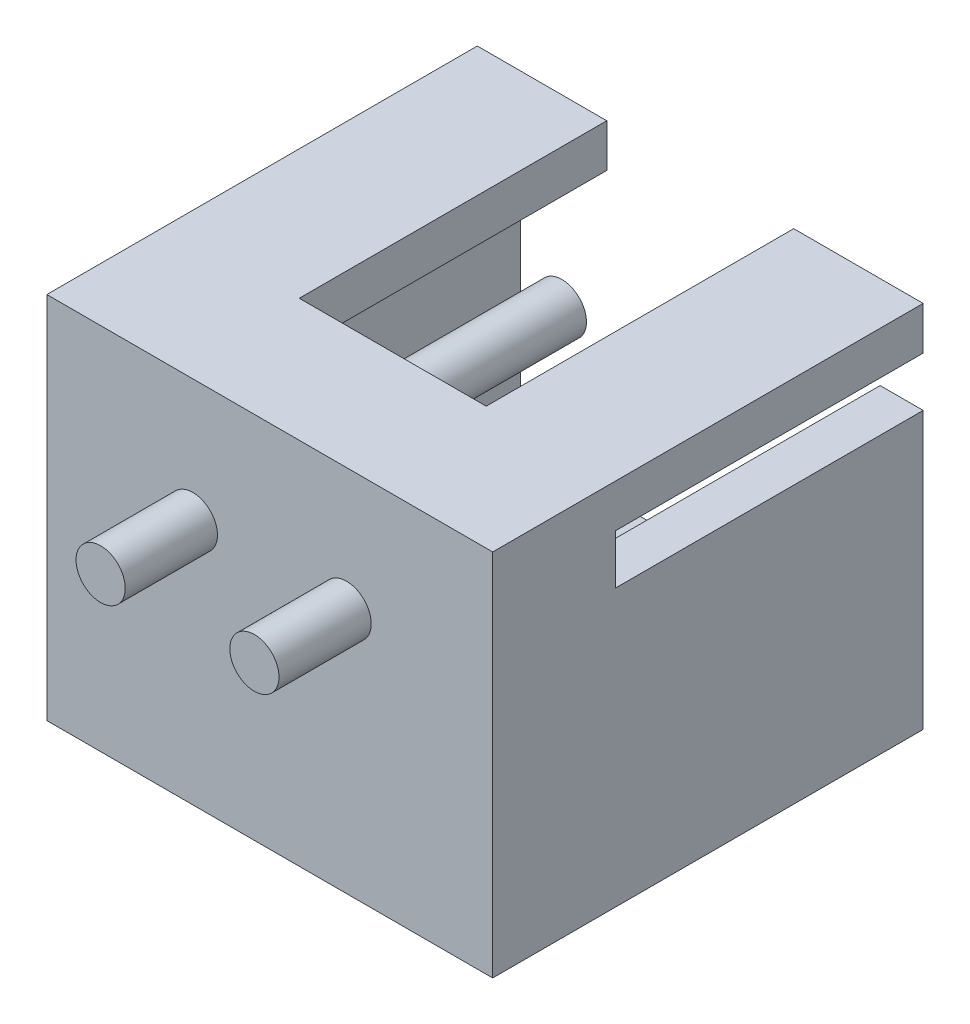
ISO-10303-21;
HEADER;
FILE_DESCRIPTION(('STEP AP214'),'2;1');
FILE_NAME('part.step','',(''),(''),'','','');
FILE_SCHEMA(('AUTOMOTIVE_DESIGN { 1 0 10303 214 1 1 1 1 }'));
ENDSEC;
DATA;
#1=APPLICATION_CONTEXT('core data for automotive mechanical design processes');
#2=APPLICATION_PROTOCOL_DEFINITION('international standard','automotive_design',2000,#1);
#3=PRODUCT_CONTEXT('',#1,'mechanical');
#4=PRODUCT('Part','Part','',(#3));
#5=PRODUCT_RELATED_PRODUCT_CATEGORY('part','',(#4));
#6=PRODUCT_DEFINITION_FORMATION('','',#4);
#7=PRODUCT_DEFINITION_CONTEXT('part definition',#1,'design');
#8=PRODUCT_DEFINITION('design','',#6,#7);
#9=PRODUCT_DEFINITION_SHAPE('','',#8);
#10=(LENGTH_UNIT() NAMED_UNIT(*) SI_UNIT(.MILLI.,.METRE.));
#11=(NAMED_UNIT(*) PLANE_ANGLE_UNIT() SI_UNIT($,.RADIAN.));
#12=(NAMED_UNIT(*) SI_UNIT($,.STERADIAN.) SOLID_ANGLE_UNIT());
#13=UNCERTAINTY_MEASURE_WITH_UNIT(LENGTH_MEASURE(1.E-05),#10,'distance_accuracy_value','');
#14=(GEOMETRIC_REPRESENTATION_CONTEXT(3) GLOBAL_UNCERTAINTY_ASSIGNED_CONTEXT((#13)) GLOBAL_UNIT_ASSIGNED_CONTEXT((#10,
#11,#12)) REPRESENTATION_CONTEXT('',''));
#15=CARTESIAN_POINT('',(0.,0.,0.));
#16=DIRECTION('',(0.,0.,1.));
#17=DIRECTION('',(1.,0.,0.));
#18=AXIS2_PLACEMENT_3D('',#15,#16,#17);
#19=CARTESIAN_POINT('',(0.,6.,0.));
#20=DIRECTION('',(0.,0.,-1.));
#21=DIRECTION('',(-1.,0.,0.));
#22=AXIS2_PLACEMENT_3D('',#19,#20,#21);
#23=PLANE('',#22);
#24=DIRECTION('',(0.,1.,0.));
#25=VECTOR('',#24,1.);
#26=CARTESIAN_POINT('',(2.10510504665402,6.,0.));
#27=LINE('',#26,#25);
#28=CARTESIAN_POINT('',(2.10510504665401,5.3,0.));
#29=VERTEX_POINT('',#28);
#30=CARTESIAN_POINT('',(2.10510504665402,6.,0.));
#31=VERTEX_POINT('',#30);
#32=EDGE_CURVE('E156',#29,#31,#27,.T.);
#33=ORIENTED_EDGE('',*,*,#32,.F.);
#34=DIRECTION('',(-1.,0.,0.));
#35=VECTOR('',#34,1.);
#36=CARTESIAN_POINT('',(0.7,5.3,0.));
#37=LINE('',#36,#35);
#38=CARTESIAN_POINT('',(0.,5.3,0.));
#39=VERTEX_POINT('',#38);
#40=EDGE_CURVE('E218',#29,#39,#37,.T.);
#41=ORIENTED_EDGE('',*,*,#40,.T.);
#42=DIRECTION('',(0.,-1.,0.));
#43=VECTOR('',#42,1.);
#44=CARTESIAN_POINT('',(0.,0.,0.));
#45=LINE('',#44,#43);
#46=CARTESIAN_POINT('',(0.,6.,0.));
#47=VERTEX_POINT('',#46);
#48=EDGE_CURVE('E246',#47,#39,#45,.T.);
#49=ORIENTED_EDGE('',*,*,#48,.F.);
#50=DIRECTION('',(-1.,0.,0.));
#51=VECTOR('',#50,1.);
#52=CARTESIAN_POINT('',(0.,6.,0.));
#53=LINE('',#52,#51);
#54=EDGE_CURVE('E173',#31,#47,#53,.T.);
#55=ORIENTED_EDGE('',*,*,#54,.F.);
#56=EDGE_LOOP('',(#33,#41,#49,#55));
#57=FACE_BOUND('',#56,.T.);
#58=ADVANCED_FACE('F35',(#57),#23,.T.);
#59=CARTESIAN_POINT('',(0.7,5.3,5.));
#60=DIRECTION('',(0.,-1.,0.));
#61=DIRECTION('',(0.,0.,-1.));
#62=AXIS2_PLACEMENT_3D('',#59,#60,#61);
#63=PLANE('',#62);
#64=DIRECTION('',(0.,0.,-1.));
#65=VECTOR('',#64,1.);
#66=CARTESIAN_POINT('',(2.10510504665401,5.3,8.1193465143883));
#67=LINE('',#66,#65);
#68=CARTESIAN_POINT('',(2.10510504665401,5.3,5.));
#69=VERTEX_POINT('',#68);
#70=EDGE_CURVE('E287',#69,#29,#67,.T.);
#71=ORIENTED_EDGE('',*,*,#70,.F.);
#72=DIRECTION('',(-1.,0.,0.));
#73=VECTOR('',#72,1.);
#74=CARTESIAN_POINT('',(0.7,5.3,5.));
#75=LINE('',#74,#73);
#76=CARTESIAN_POINT('',(0.,5.3,5.));
#77=VERTEX_POINT('',#76);
#78=EDGE_CURVE('E225',#69,#77,#75,.T.);
#79=ORIENTED_EDGE('',*,*,#78,.T.);
#80=DIRECTION('',(0.,0.,-1.));
#81=VECTOR('',#80,1.);
#82=CARTESIAN_POINT('',(0.,5.3,8.1193465143883));
#83=LINE('',#82,#81);
#84=EDGE_CURVE('E296',#77,#39,#83,.T.);
#85=ORIENTED_EDGE('',*,*,#84,.T.);
#86=ORIENTED_EDGE('',*,*,#40,.F.);
#87=EDGE_LOOP('',(#71,#79,#85,#86));
#88=FACE_BOUND('',#87,.T.);
#89=ADVANCED_FACE('F321',(#88),#63,.T.);
#90=DIRECTION('',(0.,-1.,0.));
#91=VECTOR('',#90,1.);
#92=CARTESIAN_POINT('',(5.14489495334599,6.,0.));
#93=LINE('',#92,#91);
#94=CARTESIAN_POINT('',(5.14489495334599,6.,0.));
#95=VERTEX_POINT('',#94);
#96=CARTESIAN_POINT('',(5.14489495334599,5.3,0.));
#97=VERTEX_POINT('',#96);
#98=EDGE_CURVE('E150',#95,#97,#93,.T.);
#99=ORIENTED_EDGE('',*,*,#98,.F.);
#100=CARTESIAN_POINT('',(7.25,6.,0.));
#101=VERTEX_POINT('',#100);
#102=EDGE_CURVE('E163',#101,#95,#53,.T.);
#103=ORIENTED_EDGE('',*,*,#102,.F.);
#104=DIRECTION('',(0.,1.,0.));
#105=VECTOR('',#104,1.);
#106=CARTESIAN_POINT('',(7.25,0.,0.));
#107=LINE('',#106,#105);
#108=CARTESIAN_POINT('',(7.25,5.3,0.));
#109=VERTEX_POINT('',#108);
#110=EDGE_CURVE('E249',#109,#101,#107,.T.);
#111=ORIENTED_EDGE('',*,*,#110,.F.);
#112=EDGE_CURVE('E164',#109,#97,#37,.T.);
#113=ORIENTED_EDGE('',*,*,#112,.T.);
#114=EDGE_LOOP('',(#99,#103,#111,#113));
#115=FACE_BOUND('',#114,.T.);
#116=ADVANCED_FACE('F161',(#115),#23,.T.);
#117=DIRECTION('',(-1.,0.,0.));
#118=VECTOR('',#117,1.);
#119=CARTESIAN_POINT('',(0.,4.49313289990312,0.));
#120=LINE('',#119,#118);
#121=CARTESIAN_POINT('',(0.7,4.49313289990312,0.));
#122=VERTEX_POINT('',#121);
#123=CARTESIAN_POINT('',(0.,4.49313289990312,0.));
#124=VERTEX_POINT('',#123);
#125=EDGE_CURVE('E294',#122,#124,#120,.T.);
#126=ORIENTED_EDGE('',*,*,#125,.F.);
#127=DIRECTION('',(0.,-1.,0.));
#128=VECTOR('',#127,1.);
#129=CARTESIAN_POINT('',(0.699999999999999,0.699999999999999,0.));
#130=LINE('',#129,#128);
#131=CARTESIAN_POINT('',(0.699999999999999,0.699999999999999,0.));
#132=VERTEX_POINT('',#131);
#133=EDGE_CURVE('E230',#122,#132,#130,.T.);
#134=ORIENTED_EDGE('',*,*,#133,.T.);
#135=DIRECTION('',(1.,0.,0.));
#136=VECTOR('',#135,1.);
#137=CARTESIAN_POINT('',(6.55,0.7,0.));
#138=LINE('',#137,#136);
#139=CARTESIAN_POINT('',(6.55,0.7,0.));
#140=VERTEX_POINT('',#139);
#141=EDGE_CURVE('E232',#132,#140,#138,.T.);
#142=ORIENTED_EDGE('',*,*,#141,.T.);
#143=DIRECTION('',(0.,1.,0.));
#144=VECTOR('',#143,1.);
#145=CARTESIAN_POINT('',(6.55,5.3,0.));
#146=LINE('',#145,#144);
#147=CARTESIAN_POINT('',(6.55,4.49313289990312,0.));
#148=VERTEX_POINT('',#147);
#149=EDGE_CURVE('E235',#140,#148,#146,.T.);
#150=ORIENTED_EDGE('',*,*,#149,.T.);
#151=DIRECTION('',(-1.,0.,0.));
#152=VECTOR('',#151,1.);
#153=CARTESIAN_POINT('',(6.55,4.49313289990312,0.));
#154=LINE('',#153,#152);
#155=CARTESIAN_POINT('',(7.25,4.49313289990312,0.));
#156=VERTEX_POINT('',#155);
#157=EDGE_CURVE('E267',#156,#148,#154,.T.);
#158=ORIENTED_EDGE('',*,*,#157,.F.);
#159=CARTESIAN_POINT('',(7.25,0.,0.));
#160=VERTEX_POINT('',#159);
#161=EDGE_CURVE('E178',#160,#156,#107,.T.);
#162=ORIENTED_EDGE('',*,*,#161,.F.);
#163=DIRECTION('',(1.,0.,0.));
#164=VECTOR('',#163,1.);
#165=CARTESIAN_POINT('',(0.,0.,0.));
#166=LINE('',#165,#164);
#167=CARTESIAN_POINT('',(0.,0.,0.));
#168=VERTEX_POINT('',#167);
#169=EDGE_CURVE('E248',#168,#160,#166,.T.);
#170=ORIENTED_EDGE('',*,*,#169,.F.);
#171=EDGE_CURVE('E240',#124,#168,#45,.T.);
#172=ORIENTED_EDGE('',*,*,#171,.F.);
#173=EDGE_LOOP('',(#126,#134,#142,#150,#158,#162,#170,#172));
#174=FACE_BOUND('',#173,.T.);
#175=ADVANCED_FACE('F265',(#174),#23,.T.);
#176=CARTESIAN_POINT('',(0.,0.,7.));
#177=DIRECTION('',(1.,0.,0.));
#178=DIRECTION('',(0.,0.,-1.));
#179=AXIS2_PLACEMENT_3D('',#176,#177,#178);
#180=PLANE('',#179);
#181=ORIENTED_EDGE('',*,*,#48,.T.);
#182=ORIENTED_EDGE('',*,*,#84,.F.);
#183=DIRECTION('',(0.,-1.,0.));
#184=VECTOR('',#183,1.);
#185=CARTESIAN_POINT('',(0.,5.3,5.));
#186=LINE('',#185,#184);
#187=CARTESIAN_POINT('',(0.,4.49313289990312,5.));
#188=VERTEX_POINT('',#187);
#189=EDGE_CURVE('E271',#77,#188,#186,.T.);
#190=ORIENTED_EDGE('',*,*,#189,.T.);
#191=DIRECTION('',(0.,0.,-1.));
#192=VECTOR('',#191,1.);
#193=CARTESIAN_POINT('',(0.,4.49313289990312,8.1193465143883));
#194=LINE('',#193,#192);
#195=EDGE_CURVE('E302',#188,#124,#194,.T.);
#196=ORIENTED_EDGE('',*,*,#195,.T.);
#197=ORIENTED_EDGE('',*,*,#171,.T.);
#198=DIRECTION('',(0.,0.,-1.));
#199=VECTOR('',#198,1.);
#200=CARTESIAN_POINT('',(0.,0.,7.));
#201=LINE('',#200,#199);
#202=CARTESIAN_POINT('',(0.,0.,7.));
#203=VERTEX_POINT('',#202);
#204=EDGE_CURVE('E190',#203,#168,#201,.T.);
#205=ORIENTED_EDGE('',*,*,#204,.F.);
#206=DIRECTION('',(0.,-1.,0.));
#207=VECTOR('',#206,1.);
#208=CARTESIAN_POINT('',(0.,0.,7.));
#209=LINE('',#208,#207);
#210=CARTESIAN_POINT('',(0.,6.,7.));
#211=VERTEX_POINT('',#210);
#212=EDGE_CURVE('E172',#211,#203,#209,.T.);
#213=ORIENTED_EDGE('',*,*,#212,.F.);
#214=DIRECTION('',(0.,0.,-1.));
#215=VECTOR('',#214,1.);
#216=CARTESIAN_POINT('',(0.,6.,7.));
#217=LINE('',#216,#215);
#218=EDGE_CURVE('E182',#211,#47,#217,.T.);
#219=ORIENTED_EDGE('',*,*,#218,.T.);
#220=EDGE_LOOP('',(#181,#182,#190,#196,#197,#205,#213,#219));
#221=FACE_BOUND('',#220,.T.);
#222=ADVANCED_FACE('F37',(#221),#180,.F.);
#223=CARTESIAN_POINT('',(0.,0.,7.));
#224=DIRECTION('',(0.,1.,0.));
#225=DIRECTION('',(0.,0.,1.));
#226=AXIS2_PLACEMENT_3D('',#223,#224,#225);
#227=PLANE('',#226);
#228=ORIENTED_EDGE('',*,*,#169,.T.);
#229=DIRECTION('',(0.,0.,-1.));
#230=VECTOR('',#229,1.);
#231=CARTESIAN_POINT('',(7.25,0.,7.));
#232=LINE('',#231,#230);
#233=CARTESIAN_POINT('',(7.25,0.,7.));
#234=VERTEX_POINT('',#233);
#235=EDGE_CURVE('E187',#234,#160,#232,.T.);
#236=ORIENTED_EDGE('',*,*,#235,.F.);
#237=DIRECTION('',(1.,0.,0.));
#238=VECTOR('',#237,1.);
#239=CARTESIAN_POINT('',(0.,0.,7.));
#240=LINE('',#239,#238);
#241=EDGE_CURVE('E176',#203,#234,#240,.T.);
#242=ORIENTED_EDGE('',*,*,#241,.F.);
#243=ORIENTED_EDGE('',*,*,#204,.T.);
#244=EDGE_LOOP('',(#228,#236,#242,#243));
#245=FACE_BOUND('',#244,.T.);
#246=ADVANCED_FACE('F337',(#245),#227,.F.);
#247=CARTESIAN_POINT('',(7.25,0.,7.));
#248=DIRECTION('',(-1.,0.,0.));
#249=DIRECTION('',(0.,0.,1.));
#250=AXIS2_PLACEMENT_3D('',#247,#248,#249);
#251=PLANE('',#250);
#252=DIRECTION('',(0.,1.,0.));
#253=VECTOR('',#252,1.);
#254=CARTESIAN_POINT('',(7.25,4.49313289990312,5.));
#255=LINE('',#254,#253);
#256=CARTESIAN_POINT('',(7.25,4.49313289990312,5.));
#257=VERTEX_POINT('',#256);
#258=CARTESIAN_POINT('',(7.25,5.3,5.));
#259=VERTEX_POINT('',#258);
#260=EDGE_CURVE('E278',#257,#259,#255,.T.);
#261=ORIENTED_EDGE('',*,*,#260,.T.);
#262=DIRECTION('',(0.,0.,-1.));
#263=VECTOR('',#262,1.);
#264=CARTESIAN_POINT('',(7.25,5.3,8.1193465143883));
#265=LINE('',#264,#263);
#266=EDGE_CURVE('E280',#259,#109,#265,.T.);
#267=ORIENTED_EDGE('',*,*,#266,.T.);
#268=ORIENTED_EDGE('',*,*,#110,.T.);
#269=DIRECTION('',(0.,0.,-1.));
#270=VECTOR('',#269,1.);
#271=CARTESIAN_POINT('',(7.25,6.,7.));
#272=LINE('',#271,#270);
#273=CARTESIAN_POINT('',(7.25,6.,7.));
#274=VERTEX_POINT('',#273);
#275=EDGE_CURVE('E171',#274,#101,#272,.T.);
#276=ORIENTED_EDGE('',*,*,#275,.F.);
#277=DIRECTION('',(0.,1.,0.));
#278=VECTOR('',#277,1.);
#279=CARTESIAN_POINT('',(7.25,0.,7.));
#280=LINE('',#279,#278);
#281=EDGE_CURVE('E243',#234,#274,#280,.T.);
#282=ORIENTED_EDGE('',*,*,#281,.F.);
#283=ORIENTED_EDGE('',*,*,#235,.T.);
#284=ORIENTED_EDGE('',*,*,#161,.T.);
#285=DIRECTION('',(0.,0.,-1.));
#286=VECTOR('',#285,1.);
#287=CARTESIAN_POINT('',(7.25,4.49313289990312,8.1193465143883));
#288=LINE('',#287,#286);
#289=EDGE_CURVE('E260',#257,#156,#288,.T.);
#290=ORIENTED_EDGE('',*,*,#289,.F.);
#291=EDGE_LOOP('',(#261,#267,#268,#276,#282,#283,#284,#290));
#292=FACE_BOUND('',#291,.T.);
#293=ADVANCED_FACE('F259',(#292),#251,.F.);
#294=CARTESIAN_POINT('',(0.,6.,7.));
#295=DIRECTION('',(0.,-1.,0.));
#296=DIRECTION('',(0.,0.,-1.));
#297=AXIS2_PLACEMENT_3D('',#294,#295,#296);
#298=PLANE('',#297);
#299=DIRECTION('',(-1.,0.,0.));
#300=VECTOR('',#299,1.);
#301=CARTESIAN_POINT('',(5.14489495334599,6.,5.));
#302=LINE('',#301,#300);
#303=CARTESIAN_POINT('',(5.14489495334599,6.,5.));
#304=VERTEX_POINT('',#303);
#305=CARTESIAN_POINT('',(2.10510504665402,6.,5.));
#306=VERTEX_POINT('',#305);
#307=EDGE_CURVE('E295',#304,#306,#302,.T.);
#308=ORIENTED_EDGE('',*,*,#307,.T.);
#309=DIRECTION('',(0.,0.,-1.));
#310=VECTOR('',#309,1.);
#311=CARTESIAN_POINT('',(2.10510504665402,6.,8.1193465143883));
#312=LINE('',#311,#310);
#313=EDGE_CURVE('E289',#306,#31,#312,.T.);
#314=ORIENTED_EDGE('',*,*,#313,.T.);
#315=ORIENTED_EDGE('',*,*,#54,.T.);
#316=ORIENTED_EDGE('',*,*,#218,.F.);
#317=DIRECTION('',(-1.,0.,0.));
#318=VECTOR('',#317,1.);
#319=CARTESIAN_POINT('',(0.,6.,7.));
#320=LINE('',#319,#318);
#321=EDGE_CURVE('E185',#274,#211,#320,.T.);
#322=ORIENTED_EDGE('',*,*,#321,.F.);
#323=ORIENTED_EDGE('',*,*,#275,.T.);
#324=ORIENTED_EDGE('',*,*,#102,.T.);
#325=DIRECTION('',(0.,0.,-1.));
#326=VECTOR('',#325,1.);
#327=CARTESIAN_POINT('',(5.14489495334599,6.,8.1193465143883));
#328=LINE('',#327,#326);
#329=EDGE_CURVE('E147',#304,#95,#328,.T.);
#330=ORIENTED_EDGE('',*,*,#329,.F.);
#331=EDGE_LOOP('',(#308,#314,#315,#316,#322,#323,#324,#330));
#332=FACE_BOUND('',#331,.T.);
#333=ADVANCED_FACE('F168',(#332),#298,.F.);
#334=CARTESIAN_POINT('',(0.,6.,7.));
#335=DIRECTION('',(0.,0.,-1.));
#336=DIRECTION('',(-1.,0.,0.));
#337=AXIS2_PLACEMENT_3D('',#334,#335,#336);
#338=PLANE('',#337);
#339=CARTESIAN_POINT('',(2.375,4.,7.));
#340=DIRECTION('',(0.,0.,-1.));
#341=DIRECTION('',(-1.,0.,0.));
#342=AXIS2_PLACEMENT_3D('',#339,#340,#341);
#343=CIRCLE('',#342,0.400000000000001);
#344=CARTESIAN_POINT('',(1.975,4.,7.));
#345=VERTEX_POINT('',#344);
#346=EDGE_CURVE('E368',#345,#345,#343,.T.);
#347=ORIENTED_EDGE('',*,*,#346,.T.);
#348=EDGE_LOOP('',(#347));
#349=FACE_BOUND('',#348,.T.);
#350=CARTESIAN_POINT('',(4.875,4.,7.));
#351=DIRECTION('',(0.,0.,-1.));
#352=DIRECTION('',(-1.,0.,0.));
#353=AXIS2_PLACEMENT_3D('',#350,#351,#352);
#354=CIRCLE('',#353,0.4);
#355=CARTESIAN_POINT('',(4.475,4.,7.));
#356=VERTEX_POINT('',#355);
#357=EDGE_CURVE('E165',#356,#356,#354,.T.);
#358=ORIENTED_EDGE('',*,*,#357,.T.);
#359=EDGE_LOOP('',(#358));
#360=FACE_BOUND('',#359,.T.);
#361=ORIENTED_EDGE('',*,*,#212,.T.);
#362=ORIENTED_EDGE('',*,*,#241,.T.);
#363=ORIENTED_EDGE('',*,*,#281,.T.);
#364=ORIENTED_EDGE('',*,*,#321,.T.);
#365=EDGE_LOOP('',(#361,#362,#363,#364));
#366=FACE_BOUND('',#365,.T.);
#367=ADVANCED_FACE('F318',(#349,#360,#366),#338,.F.);
#368=CARTESIAN_POINT('',(0.699999999999999,0.699999999999999,5.));
#369=DIRECTION('',(1.,0.,0.));
#370=DIRECTION('',(0.,1.,0.));
#371=AXIS2_PLACEMENT_3D('',#368,#369,#370);
#372=PLANE('',#371);
#373=DIRECTION('',(0.,0.,-1.));
#374=VECTOR('',#373,1.);
#375=CARTESIAN_POINT('',(0.7,4.49313289990312,8.1193465143883));
#376=LINE('',#375,#374);
#377=CARTESIAN_POINT('',(0.7,4.49313289990312,5.));
#378=VERTEX_POINT('',#377);
#379=EDGE_CURVE('E299',#378,#122,#376,.T.);
#380=ORIENTED_EDGE('',*,*,#379,.F.);
#381=DIRECTION('',(0.,-1.,0.));
#382=VECTOR('',#381,1.);
#383=CARTESIAN_POINT('',(0.699999999999999,0.699999999999999,5.));
#384=LINE('',#383,#382);
#385=CARTESIAN_POINT('',(0.699999999999999,0.699999999999999,5.));
#386=VERTEX_POINT('',#385);
#387=EDGE_CURVE('E206',#378,#386,#384,.T.);
#388=ORIENTED_EDGE('',*,*,#387,.T.);
#389=DIRECTION('',(0.,0.,-1.));
#390=VECTOR('',#389,1.);
#391=CARTESIAN_POINT('',(0.699999999999999,0.699999999999999,5.));
#392=LINE('',#391,#390);
#393=EDGE_CURVE('E239',#386,#132,#392,.T.);
#394=ORIENTED_EDGE('',*,*,#393,.T.);
#395=ORIENTED_EDGE('',*,*,#133,.F.);
#396=EDGE_LOOP('',(#380,#388,#394,#395));
#397=FACE_BOUND('',#396,.T.);
#398=ADVANCED_FACE('F308',(#397),#372,.T.);
#399=CARTESIAN_POINT('',(6.55,0.7,5.));
#400=DIRECTION('',(0.,1.,0.));
#401=DIRECTION('',(-1.,0.,0.));
#402=AXIS2_PLACEMENT_3D('',#399,#400,#401);
#403=PLANE('',#402);
#404=ORIENTED_EDGE('',*,*,#141,.F.);
#405=ORIENTED_EDGE('',*,*,#393,.F.);
#406=DIRECTION('',(1.,0.,0.));
#407=VECTOR('',#406,1.);
#408=CARTESIAN_POINT('',(6.55,0.7,5.));
#409=LINE('',#408,#407);
#410=CARTESIAN_POINT('',(6.55,0.7,5.));
#411=VERTEX_POINT('',#410);
#412=EDGE_CURVE('E210',#386,#411,#409,.T.);
#413=ORIENTED_EDGE('',*,*,#412,.T.);
#414=DIRECTION('',(0.,0.,-1.));
#415=VECTOR('',#414,1.);
#416=CARTESIAN_POINT('',(6.55,0.7,5.));
#417=LINE('',#416,#415);
#418=EDGE_CURVE('E229',#411,#140,#417,.T.);
#419=ORIENTED_EDGE('',*,*,#418,.T.);
#420=EDGE_LOOP('',(#404,#405,#413,#419));
#421=FACE_BOUND('',#420,.T.);
#422=ADVANCED_FACE('F310',(#421),#403,.T.);
#423=CARTESIAN_POINT('',(6.55,5.3,5.));
#424=DIRECTION('',(-1.,0.,0.));
#425=DIRECTION('',(0.,0.,1.));
#426=AXIS2_PLACEMENT_3D('',#423,#424,#425);
#427=PLANE('',#426);
#428=DIRECTION('',(0.,0.,-1.));
#429=VECTOR('',#428,1.);
#430=CARTESIAN_POINT('',(6.55,4.49313289990312,8.1193465143883));
#431=LINE('',#430,#429);
#432=CARTESIAN_POINT('',(6.55,4.49313289990312,5.));
#433=VERTEX_POINT('',#432);
#434=EDGE_CURVE('E273',#433,#148,#431,.T.);
#435=ORIENTED_EDGE('',*,*,#434,.T.);
#436=ORIENTED_EDGE('',*,*,#149,.F.);
#437=ORIENTED_EDGE('',*,*,#418,.F.);
#438=DIRECTION('',(0.,1.,0.));
#439=VECTOR('',#438,1.);
#440=CARTESIAN_POINT('',(6.55,5.3,5.));
#441=LINE('',#440,#439);
#442=EDGE_CURVE('E216',#411,#433,#441,.T.);
#443=ORIENTED_EDGE('',*,*,#442,.T.);
#444=EDGE_LOOP('',(#435,#436,#437,#443));
#445=FACE_BOUND('',#444,.T.);
#446=ADVANCED_FACE('F283',(#445),#427,.T.);
#447=DIRECTION('',(0.,0.,-1.));
#448=VECTOR('',#447,1.);
#449=CARTESIAN_POINT('',(5.14489495334599,5.3,8.1193465143883));
#450=LINE('',#449,#448);
#451=CARTESIAN_POINT('',(5.14489495334599,5.3,5.));
#452=VERTEX_POINT('',#451);
#453=EDGE_CURVE('E155',#452,#97,#450,.T.);
#454=ORIENTED_EDGE('',*,*,#453,.T.);
#455=ORIENTED_EDGE('',*,*,#112,.F.);
#456=ORIENTED_EDGE('',*,*,#266,.F.);
#457=EDGE_CURVE('E226',#259,#452,#75,.T.);
#458=ORIENTED_EDGE('',*,*,#457,.T.);
#459=EDGE_LOOP('',(#454,#455,#456,#458));
#460=FACE_BOUND('',#459,.T.);
#461=ADVANCED_FACE('F201',(#460),#63,.T.);
#462=CARTESIAN_POINT('',(0.7,5.3,5.));
#463=DIRECTION('',(0.,0.,-1.));
#464=DIRECTION('',(-1.,0.,0.));
#465=AXIS2_PLACEMENT_3D('',#462,#463,#464);
#466=PLANE('',#465);
#467=CARTESIAN_POINT('',(2.375,4.,5.));
#468=DIRECTION('',(0.,0.,-1.));
#469=DIRECTION('',(-1.,0.,0.));
#470=AXIS2_PLACEMENT_3D('',#467,#468,#469);
#471=CIRCLE('',#470,0.400000000000001);
#472=CARTESIAN_POINT('',(1.975,4.,5.));
#473=VERTEX_POINT('',#472);
#474=EDGE_CURVE('E11',#473,#473,#471,.T.);
#475=ORIENTED_EDGE('',*,*,#474,.F.);
#476=EDGE_LOOP('',(#475));
#477=FACE_BOUND('',#476,.T.);
#478=CARTESIAN_POINT('',(4.875,4.,5.));
#479=DIRECTION('',(0.,0.,-1.));
#480=DIRECTION('',(-1.,0.,0.));
#481=AXIS2_PLACEMENT_3D('',#478,#479,#480);
#482=CIRCLE('',#481,0.4);
#483=CARTESIAN_POINT('',(4.475,4.,5.));
#484=VERTEX_POINT('',#483);
#485=EDGE_CURVE('E43',#484,#484,#482,.T.);
#486=ORIENTED_EDGE('',*,*,#485,.F.);
#487=EDGE_LOOP('',(#486));
#488=FACE_BOUND('',#487,.T.);
#489=ORIENTED_EDGE('',*,*,#387,.F.);
#490=DIRECTION('',(1.,0.,0.));
#491=VECTOR('',#490,1.);
#492=CARTESIAN_POINT('',(0.,4.49313289990312,5.));
#493=LINE('',#492,#491);
#494=EDGE_CURVE('E208',#188,#378,#493,.T.);
#495=ORIENTED_EDGE('',*,*,#494,.F.);
#496=ORIENTED_EDGE('',*,*,#189,.F.);
#497=ORIENTED_EDGE('',*,*,#78,.F.);
#498=DIRECTION('',(0.,-1.,0.));
#499=VECTOR('',#498,1.);
#500=CARTESIAN_POINT('',(2.10510504665402,6.,5.));
#501=LINE('',#500,#499);
#502=EDGE_CURVE('E355',#306,#69,#501,.T.);
#503=ORIENTED_EDGE('',*,*,#502,.F.);
#504=ORIENTED_EDGE('',*,*,#307,.F.);
#505=DIRECTION('',(0.,1.,0.));
#506=VECTOR('',#505,1.);
#507=CARTESIAN_POINT('',(5.14489495334599,6.,5.));
#508=LINE('',#507,#506);
#509=EDGE_CURVE('E50',#452,#304,#508,.T.);
#510=ORIENTED_EDGE('',*,*,#509,.F.);
#511=ORIENTED_EDGE('',*,*,#457,.F.);
#512=ORIENTED_EDGE('',*,*,#260,.F.);
#513=DIRECTION('',(1.,0.,0.));
#514=VECTOR('',#513,1.);
#515=CARTESIAN_POINT('',(6.55,4.49313289990312,5.));
#516=LINE('',#515,#514);
#517=EDGE_CURVE('E57',#433,#257,#516,.T.);
#518=ORIENTED_EDGE('',*,*,#517,.F.);
#519=ORIENTED_EDGE('',*,*,#442,.F.);
#520=ORIENTED_EDGE('',*,*,#412,.F.);
#521=EDGE_LOOP('',(#489,#495,#496,#497,#503,#504,#510,#511,#512,#518,#519,#520));
#522=FACE_BOUND('',#521,.T.);
#523=ADVANCED_FACE('F198',(#477,#488,#522),#466,.T.);
#524=CARTESIAN_POINT('',(6.55,4.49313289990312,8.1193465143883));
#525=DIRECTION('',(0.,-1.,0.));
#526=DIRECTION('',(0.,0.,-1.));
#527=AXIS2_PLACEMENT_3D('',#524,#525,#526);
#528=PLANE('',#527);
#529=ORIENTED_EDGE('',*,*,#517,.T.);
#530=ORIENTED_EDGE('',*,*,#289,.T.);
#531=ORIENTED_EDGE('',*,*,#157,.T.);
#532=ORIENTED_EDGE('',*,*,#434,.F.);
#533=EDGE_LOOP('',(#529,#530,#531,#532));
#534=FACE_BOUND('',#533,.T.);
#535=ADVANCED_FACE('F200',(#534),#528,.F.);
#536=CARTESIAN_POINT('',(0.,4.49313289990312,8.1193465143883));
#537=DIRECTION('',(0.,-1.,0.));
#538=DIRECTION('',(0.,0.,-1.));
#539=AXIS2_PLACEMENT_3D('',#536,#537,#538);
#540=PLANE('',#539);
#541=ORIENTED_EDGE('',*,*,#494,.T.);
#542=ORIENTED_EDGE('',*,*,#379,.T.);
#543=ORIENTED_EDGE('',*,*,#125,.T.);
#544=ORIENTED_EDGE('',*,*,#195,.F.);
#545=EDGE_LOOP('',(#541,#542,#543,#544));
#546=FACE_BOUND('',#545,.T.);
#547=ADVANCED_FACE('F305',(#546),#540,.F.);
#548=CARTESIAN_POINT('',(2.10510504665402,6.,8.1193465143883));
#549=DIRECTION('',(-1.,0.,0.));
#550=DIRECTION('',(0.,-1.,0.));
#551=AXIS2_PLACEMENT_3D('',#548,#549,#550);
#552=PLANE('',#551);
#553=ORIENTED_EDGE('',*,*,#502,.T.);
#554=ORIENTED_EDGE('',*,*,#70,.T.);
#555=ORIENTED_EDGE('',*,*,#32,.T.);
#556=ORIENTED_EDGE('',*,*,#313,.F.);
#557=EDGE_LOOP('',(#553,#554,#555,#556));
#558=FACE_BOUND('',#557,.T.);
#559=ADVANCED_FACE('F405',(#558),#552,.F.);
#560=CARTESIAN_POINT('',(5.14489495334599,6.,8.1193465143883));
#561=DIRECTION('',(1.,0.,0.));
#562=DIRECTION('',(0.,1.,0.));
#563=AXIS2_PLACEMENT_3D('',#560,#561,#562);
#564=PLANE('',#563);
#565=ORIENTED_EDGE('',*,*,#509,.T.);
#566=ORIENTED_EDGE('',*,*,#329,.T.);
#567=ORIENTED_EDGE('',*,*,#98,.T.);
#568=ORIENTED_EDGE('',*,*,#453,.F.);
#569=EDGE_LOOP('',(#565,#566,#567,#568));
#570=FACE_BOUND('',#569,.T.);
#571=ADVANCED_FACE('F149',(#570),#564,.F.);
#572=CARTESIAN_POINT('',(4.875,4.,1.));
#573=DIRECTION('',(0.,0.,-1.));
#574=DIRECTION('',(-1.,0.,0.));
#575=AXIS2_PLACEMENT_3D('',#572,#573,#574);
#576=PLANE('',#575);
#577=CARTESIAN_POINT('',(4.875,4.,1.));
#578=DIRECTION('',(0.,0.,-1.));
#579=DIRECTION('',(-1.,0.,0.));
#580=AXIS2_PLACEMENT_3D('',#577,#578,#579);
#581=CIRCLE('',#580,0.4);
#582=CARTESIAN_POINT('',(4.475,4.,1.));
#583=VERTEX_POINT('',#582);
#584=EDGE_CURVE('E365',#583,#583,#581,.T.);
#585=ORIENTED_EDGE('',*,*,#584,.T.);
#586=EDGE_LOOP('',(#585));
#587=FACE_BOUND('',#586,.T.);
#588=ADVANCED_FACE('F395',(#587),#576,.T.);
#589=CARTESIAN_POINT('',(4.875,4.,8.5));
#590=DIRECTION('',(0.,0.,-1.));
#591=DIRECTION('',(-1.,0.,0.));
#592=AXIS2_PLACEMENT_3D('',#589,#590,#591);
#593=CYLINDRICAL_SURFACE('',#592,0.4);
#594=ORIENTED_EDGE('',*,*,#485,.T.);
#595=EDGE_LOOP('',(#594));
#596=FACE_BOUND('',#595,.T.);
#597=ORIENTED_EDGE('',*,*,#584,.F.);
#598=EDGE_LOOP('',(#597));
#599=FACE_BOUND('',#598,.T.);
#600=ADVANCED_FACE('F195',(#596,#599),#593,.T.);
#601=CARTESIAN_POINT('',(4.875,4.,8.5));
#602=DIRECTION('',(0.,0.,-1.));
#603=DIRECTION('',(-1.,0.,0.));
#604=AXIS2_PLACEMENT_3D('',#601,#602,#603);
#605=CIRCLE('',#604,0.4);
#606=CARTESIAN_POINT('',(4.475,4.,8.5));
#607=VERTEX_POINT('',#606);
#608=EDGE_CURVE('E362',#607,#607,#605,.T.);
#609=ORIENTED_EDGE('',*,*,#608,.T.);
#610=EDGE_LOOP('',(#609));
#611=FACE_BOUND('',#610,.T.);
#612=ORIENTED_EDGE('',*,*,#357,.F.);
#613=EDGE_LOOP('',(#612));
#614=FACE_BOUND('',#613,.T.);
#615=ADVANCED_FACE('F401',(#611,#614),#593,.T.);
#616=CARTESIAN_POINT('',(4.875,4.,8.5));
#617=DIRECTION('',(0.,0.,-1.));
#618=DIRECTION('',(-1.,0.,0.));
#619=AXIS2_PLACEMENT_3D('',#616,#617,#618);
#620=PLANE('',#619);
#621=ORIENTED_EDGE('',*,*,#608,.F.);
#622=EDGE_LOOP('',(#621));
#623=FACE_BOUND('',#622,.T.);
#624=ADVANCED_FACE('F391',(#623),#620,.F.);
#625=CARTESIAN_POINT('',(2.375,4.,1.));
#626=DIRECTION('',(0.,0.,1.));
#627=DIRECTION('',(1.,0.,0.));
#628=AXIS2_PLACEMENT_3D('',#625,#626,#627);
#629=PLANE('',#628);
#630=CARTESIAN_POINT('',(2.375,4.,1.));
#631=DIRECTION('',(0.,0.,-1.));
#632=DIRECTION('',(1.,0.,0.));
#633=AXIS2_PLACEMENT_3D('',#630,#631,#632);
#634=CIRCLE('',#633,0.400000000000001);
#635=CARTESIAN_POINT('',(2.775,4.,1.));
#636=VERTEX_POINT('',#635);
#637=EDGE_CURVE('E374',#636,#636,#634,.T.);
#638=ORIENTED_EDGE('',*,*,#637,.T.);
#639=EDGE_LOOP('',(#638));
#640=FACE_BOUND('',#639,.T.);
#641=ADVANCED_FACE('F378',(#640),#629,.F.);
#642=CARTESIAN_POINT('',(2.375,4.,8.5));
#643=DIRECTION('',(0.,0.,-1.));
#644=DIRECTION('',(-1.,0.,0.));
#645=AXIS2_PLACEMENT_3D('',#642,#643,#644);
#646=CYLINDRICAL_SURFACE('',#645,0.400000000000001);
#647=ORIENTED_EDGE('',*,*,#474,.T.);
#648=EDGE_LOOP('',(#647));
#649=FACE_BOUND('',#648,.T.);
#650=ORIENTED_EDGE('',*,*,#637,.F.);
#651=EDGE_LOOP('',(#650));
#652=FACE_BOUND('',#651,.T.);
#653=ADVANCED_FACE('F380',(#649,#652),#646,.T.);
#654=CARTESIAN_POINT('',(2.375,4.,8.5));
#655=DIRECTION('',(0.,0.,-1.));
#656=DIRECTION('',(1.,0.,0.));
#657=AXIS2_PLACEMENT_3D('',#654,#655,#656);
#658=CIRCLE('',#657,0.400000000000001);
#659=CARTESIAN_POINT('',(2.775,4.,8.5));
#660=VERTEX_POINT('',#659);
#661=EDGE_CURVE('E371',#660,#660,#658,.T.);
#662=ORIENTED_EDGE('',*,*,#661,.T.);
#663=EDGE_LOOP('',(#662));
#664=FACE_BOUND('',#663,.T.);
#665=ORIENTED_EDGE('',*,*,#346,.F.);
#666=EDGE_LOOP('',(#665));
#667=FACE_BOUND('',#666,.T.);
#668=ADVANCED_FACE('F382',(#664,#667),#646,.T.);
#669=CARTESIAN_POINT('',(2.375,4.,8.5));
#670=DIRECTION('',(0.,0.,1.));
#671=DIRECTION('',(1.,0.,0.));
#672=AXIS2_PLACEMENT_3D('',#669,#670,#671);
#673=PLANE('',#672);
#674=ORIENTED_EDGE('',*,*,#661,.F.);
#675=EDGE_LOOP('',(#674));
#676=FACE_BOUND('',#675,.T.);
#677=ADVANCED_FACE('F389',(#676),#673,.T.);
#678=CLOSED_SHELL('',(#58,#89,#116,#175,#222,#246,#293,#333,#367,#398,#422,#446,#461,#523,#535,
#547,#559,#571,#588,#600,#615,#624,#641,#653,#668,#677));
#679=MANIFOLD_SOLID_BREP('B2',#678);
#680=ADVANCED_BREP_SHAPE_REPRESENTATION('',(#18,#679),#14);
#681=SHAPE_DEFINITION_REPRESENTATION(#9,#680);
ENDSEC;
END-ISO-10303-21;
